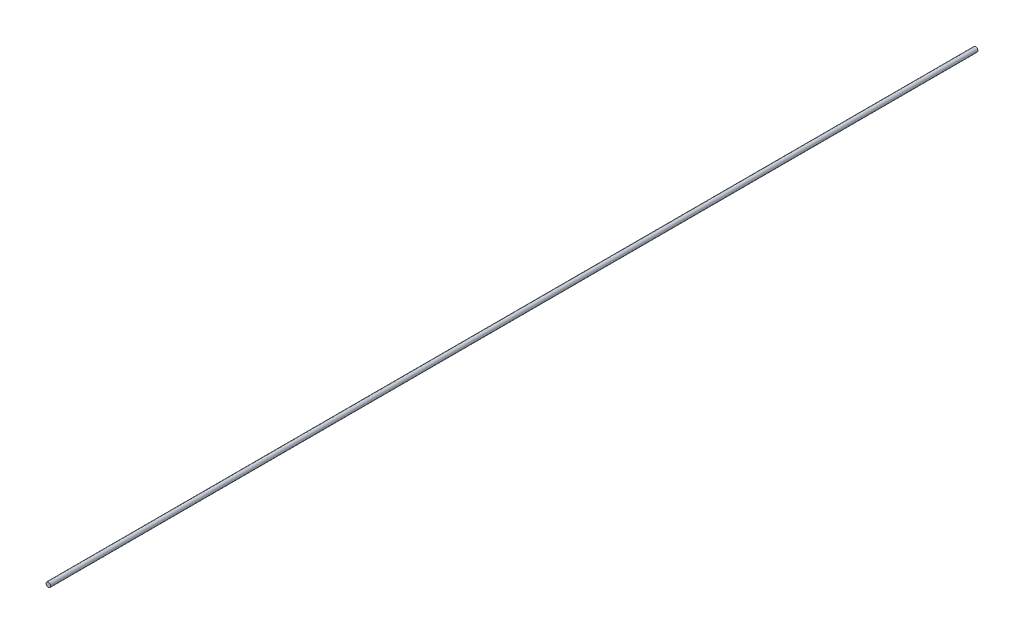
ISO-10303-21;
HEADER;
FILE_DESCRIPTION(('STEP AP214'),'2;1');
FILE_NAME('part.step','',(''),(''),'','','');
FILE_SCHEMA(('AUTOMOTIVE_DESIGN { 1 0 10303 214 1 1 1 1 }'));
ENDSEC;
DATA;
#1=APPLICATION_CONTEXT('core data for automotive mechanical design processes');
#2=APPLICATION_PROTOCOL_DEFINITION('international standard','automotive_design',2000,#1);
#3=PRODUCT_CONTEXT('',#1,'mechanical');
#4=PRODUCT('Part','Part','',(#3));
#5=PRODUCT_RELATED_PRODUCT_CATEGORY('part','',(#4));
#6=PRODUCT_DEFINITION_FORMATION('','',#4);
#7=PRODUCT_DEFINITION_CONTEXT('part definition',#1,'design');
#8=PRODUCT_DEFINITION('design','',#6,#7);
#9=PRODUCT_DEFINITION_SHAPE('','',#8);
#10=(LENGTH_UNIT() NAMED_UNIT(*) SI_UNIT(.MILLI.,.METRE.));
#11=(NAMED_UNIT(*) PLANE_ANGLE_UNIT() SI_UNIT($,.RADIAN.));
#12=(NAMED_UNIT(*) SI_UNIT($,.STERADIAN.) SOLID_ANGLE_UNIT());
#13=UNCERTAINTY_MEASURE_WITH_UNIT(LENGTH_MEASURE(1.E-05),#10,'distance_accuracy_value','');
#14=(GEOMETRIC_REPRESENTATION_CONTEXT(3) GLOBAL_UNCERTAINTY_ASSIGNED_CONTEXT((#13)) GLOBAL_UNIT_ASSIGNED_CONTEXT((#10,
#11,#12)) REPRESENTATION_CONTEXT('',''));
#15=CARTESIAN_POINT('',(0.,0.,0.));
#16=DIRECTION('',(0.,0.,1.));
#17=DIRECTION('',(1.,0.,0.));
#18=AXIS2_PLACEMENT_3D('',#15,#16,#17);
#19=CARTESIAN_POINT('',(0.,0.,140.));
#20=DIRECTION('',(0.,0.,-1.));
#21=DIRECTION('',(-1.,0.,0.));
#22=AXIS2_PLACEMENT_3D('',#19,#20,#21);
#23=CYLINDRICAL_SURFACE('',#22,0.35);
#24=CARTESIAN_POINT('',(0.,0.,140.));
#25=DIRECTION('',(0.,0.,1.));
#26=DIRECTION('',(1.,0.,0.));
#27=AXIS2_PLACEMENT_3D('',#24,#25,#26);
#28=CIRCLE('',#27,0.35);
#29=CARTESIAN_POINT('',(0.35,0.,140.));
#30=VERTEX_POINT('',#29);
#31=EDGE_CURVE('E10',#30,#30,#28,.T.);
#32=ORIENTED_EDGE('',*,*,#31,.F.);
#33=EDGE_LOOP('',(#32));
#34=FACE_BOUND('',#33,.T.);
#35=CARTESIAN_POINT('',(0.,0.,0.));
#36=DIRECTION('',(0.,0.,1.));
#37=DIRECTION('',(1.,0.,0.));
#38=AXIS2_PLACEMENT_3D('',#35,#36,#37);
#39=CIRCLE('',#38,0.35);
#40=CARTESIAN_POINT('',(0.35,0.,0.));
#41=VERTEX_POINT('',#40);
#42=EDGE_CURVE('E40',#41,#41,#39,.T.);
#43=ORIENTED_EDGE('',*,*,#42,.T.);
#44=EDGE_LOOP('',(#43));
#45=FACE_BOUND('',#44,.T.);
#46=ADVANCED_FACE('F37',(#34,#45),#23,.T.);
#47=CARTESIAN_POINT('',(0.,0.,140.));
#48=DIRECTION('',(0.,0.,1.));
#49=DIRECTION('',(1.,0.,0.));
#50=AXIS2_PLACEMENT_3D('',#47,#48,#49);
#51=PLANE('',#50);
#52=ORIENTED_EDGE('',*,*,#31,.T.);
#53=EDGE_LOOP('',(#52));
#54=FACE_BOUND('',#53,.T.);
#55=ADVANCED_FACE('F54',(#54),#51,.T.);
#56=CARTESIAN_POINT('',(0.,0.,0.));
#57=DIRECTION('',(0.,0.,1.));
#58=DIRECTION('',(1.,0.,0.));
#59=AXIS2_PLACEMENT_3D('',#56,#57,#58);
#60=PLANE('',#59);
#61=ORIENTED_EDGE('',*,*,#42,.F.);
#62=EDGE_LOOP('',(#61));
#63=FACE_BOUND('',#62,.T.);
#64=ADVANCED_FACE('F52',(#63),#60,.F.);
#65=CLOSED_SHELL('',(#46,#55,#64));
#66=MANIFOLD_SOLID_BREP('B2',#65);
#67=ADVANCED_BREP_SHAPE_REPRESENTATION('',(#18,#66),#14);
#68=SHAPE_DEFINITION_REPRESENTATION(#9,#67);
ENDSEC;
END-ISO-10303-21;
